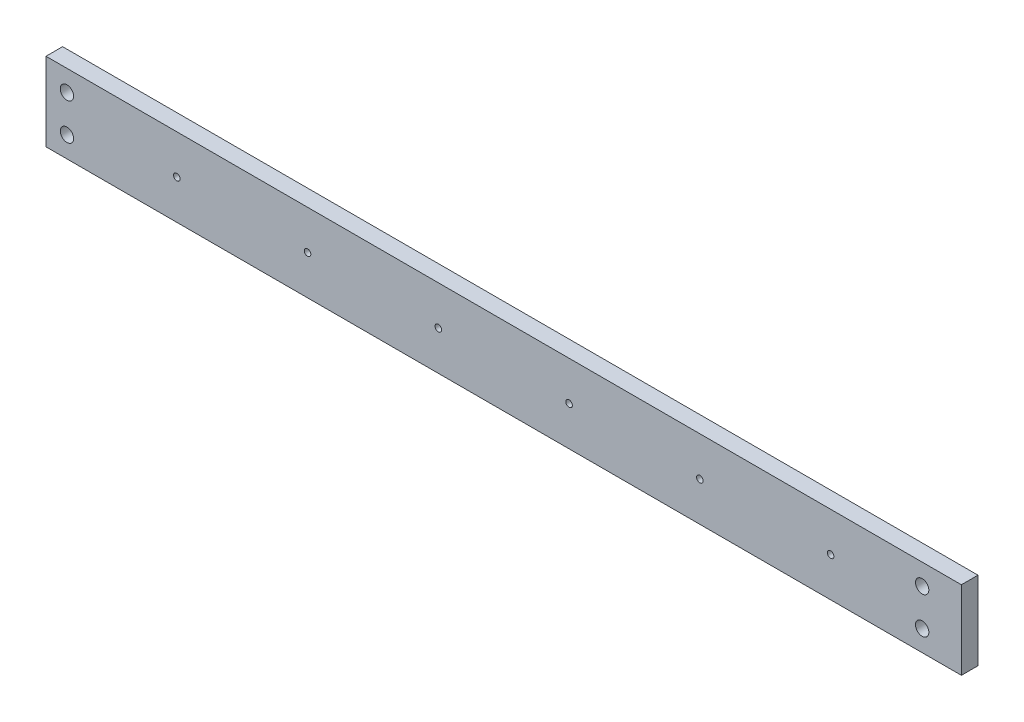
ISO-10303-21;
HEADER;
FILE_DESCRIPTION(('STEP AP214'),'2;1');
FILE_NAME('part.step','',(''),(''),'','','');
FILE_SCHEMA(('AUTOMOTIVE_DESIGN { 1 0 10303 214 1 1 1 1 }'));
ENDSEC;
DATA;
#1=APPLICATION_CONTEXT('core data for automotive mechanical design processes');
#2=APPLICATION_PROTOCOL_DEFINITION('international standard','automotive_design',2000,#1);
#3=PRODUCT_CONTEXT('',#1,'mechanical');
#4=PRODUCT('Part','Part','',(#3));
#5=PRODUCT_RELATED_PRODUCT_CATEGORY('part','',(#4));
#6=PRODUCT_DEFINITION_FORMATION('','',#4);
#7=PRODUCT_DEFINITION_CONTEXT('part definition',#1,'design');
#8=PRODUCT_DEFINITION('design','',#6,#7);
#9=PRODUCT_DEFINITION_SHAPE('','',#8);
#10=(LENGTH_UNIT() NAMED_UNIT(*) SI_UNIT(.MILLI.,.METRE.));
#11=(NAMED_UNIT(*) PLANE_ANGLE_UNIT() SI_UNIT($,.RADIAN.));
#12=(NAMED_UNIT(*) SI_UNIT($,.STERADIAN.) SOLID_ANGLE_UNIT());
#13=UNCERTAINTY_MEASURE_WITH_UNIT(LENGTH_MEASURE(1.E-05),#10,'distance_accuracy_value','');
#14=(GEOMETRIC_REPRESENTATION_CONTEXT(3) GLOBAL_UNCERTAINTY_ASSIGNED_CONTEXT((#13)) GLOBAL_UNIT_ASSIGNED_CONTEXT((#10,
#11,#12)) REPRESENTATION_CONTEXT('',''));
#15=CARTESIAN_POINT('',(0.,0.,0.));
#16=DIRECTION('',(0.,0.,1.));
#17=DIRECTION('',(1.,0.,0.));
#18=AXIS2_PLACEMENT_3D('',#15,#16,#17);
#19=CARTESIAN_POINT('',(300.,15.,6.35));
#20=DIRECTION('',(0.,0.,1.));
#21=DIRECTION('',(1.,0.,0.));
#22=AXIS2_PLACEMENT_3D('',#19,#20,#21);
#23=CYLINDRICAL_SURFACE('',#22,1.25);
#24=CARTESIAN_POINT('',(300.,15.,0.));
#25=DIRECTION('',(0.,0.,1.));
#26=DIRECTION('',(1.,0.,0.));
#27=AXIS2_PLACEMENT_3D('',#24,#25,#26);
#28=CIRCLE('',#27,1.25);
#29=CARTESIAN_POINT('',(301.25,15.,0.));
#30=VERTEX_POINT('',#29);
#31=EDGE_CURVE('E49',#30,#30,#28,.T.);
#32=ORIENTED_EDGE('',*,*,#31,.F.);
#33=EDGE_LOOP('',(#32));
#34=FACE_BOUND('',#33,.T.);
#35=CARTESIAN_POINT('',(300.,15.,6.35));
#36=DIRECTION('',(0.,0.,1.));
#37=DIRECTION('',(1.,0.,0.));
#38=AXIS2_PLACEMENT_3D('',#35,#36,#37);
#39=CIRCLE('',#38,1.25);
#40=CARTESIAN_POINT('',(301.25,15.,6.35));
#41=VERTEX_POINT('',#40);
#42=EDGE_CURVE('E11',#41,#41,#39,.T.);
#43=ORIENTED_EDGE('',*,*,#42,.T.);
#44=EDGE_LOOP('',(#43));
#45=FACE_BOUND('',#44,.T.);
#46=ADVANCED_FACE('F41',(#34,#45),#23,.F.);
#47=CARTESIAN_POINT('',(250.,15.,6.35));
#48=DIRECTION('',(0.,0.,1.));
#49=DIRECTION('',(1.,0.,0.));
#50=AXIS2_PLACEMENT_3D('',#47,#48,#49);
#51=CYLINDRICAL_SURFACE('',#50,1.25);
#52=CARTESIAN_POINT('',(250.,15.,0.));
#53=DIRECTION('',(0.,0.,1.));
#54=DIRECTION('',(1.,0.,0.));
#55=AXIS2_PLACEMENT_3D('',#52,#53,#54);
#56=CIRCLE('',#55,1.25);
#57=CARTESIAN_POINT('',(251.25,15.,0.));
#58=VERTEX_POINT('',#57);
#59=EDGE_CURVE('E131',#58,#58,#56,.T.);
#60=ORIENTED_EDGE('',*,*,#59,.F.);
#61=EDGE_LOOP('',(#60));
#62=FACE_BOUND('',#61,.T.);
#63=CARTESIAN_POINT('',(250.,15.,6.35));
#64=DIRECTION('',(0.,0.,1.));
#65=DIRECTION('',(1.,0.,0.));
#66=AXIS2_PLACEMENT_3D('',#63,#64,#65);
#67=CIRCLE('',#66,1.25);
#68=CARTESIAN_POINT('',(251.25,15.,6.35));
#69=VERTEX_POINT('',#68);
#70=EDGE_CURVE('E134',#69,#69,#67,.T.);
#71=ORIENTED_EDGE('',*,*,#70,.T.);
#72=EDGE_LOOP('',(#71));
#73=FACE_BOUND('',#72,.T.);
#74=ADVANCED_FACE('F143',(#62,#73),#51,.F.);
#75=CARTESIAN_POINT('',(200.,15.,6.35));
#76=DIRECTION('',(0.,0.,1.));
#77=DIRECTION('',(1.,0.,0.));
#78=AXIS2_PLACEMENT_3D('',#75,#76,#77);
#79=CYLINDRICAL_SURFACE('',#78,1.25);
#80=CARTESIAN_POINT('',(200.,15.,0.));
#81=DIRECTION('',(0.,0.,1.));
#82=DIRECTION('',(1.,0.,0.));
#83=AXIS2_PLACEMENT_3D('',#80,#81,#82);
#84=CIRCLE('',#83,1.25);
#85=CARTESIAN_POINT('',(201.25,15.,0.));
#86=VERTEX_POINT('',#85);
#87=EDGE_CURVE('E125',#86,#86,#84,.T.);
#88=ORIENTED_EDGE('',*,*,#87,.F.);
#89=EDGE_LOOP('',(#88));
#90=FACE_BOUND('',#89,.T.);
#91=CARTESIAN_POINT('',(200.,15.,6.35));
#92=DIRECTION('',(0.,0.,1.));
#93=DIRECTION('',(1.,0.,0.));
#94=AXIS2_PLACEMENT_3D('',#91,#92,#93);
#95=CIRCLE('',#94,1.25);
#96=CARTESIAN_POINT('',(201.25,15.,6.35));
#97=VERTEX_POINT('',#96);
#98=EDGE_CURVE('E128',#97,#97,#95,.T.);
#99=ORIENTED_EDGE('',*,*,#98,.T.);
#100=EDGE_LOOP('',(#99));
#101=FACE_BOUND('',#100,.T.);
#102=ADVANCED_FACE('F175',(#90,#101),#79,.F.);
#103=CARTESIAN_POINT('',(150.,15.,6.35));
#104=DIRECTION('',(0.,0.,1.));
#105=DIRECTION('',(1.,0.,0.));
#106=AXIS2_PLACEMENT_3D('',#103,#104,#105);
#107=CYLINDRICAL_SURFACE('',#106,1.25);
#108=CARTESIAN_POINT('',(150.,15.,0.));
#109=DIRECTION('',(0.,0.,1.));
#110=DIRECTION('',(1.,0.,0.));
#111=AXIS2_PLACEMENT_3D('',#108,#109,#110);
#112=CIRCLE('',#111,1.25);
#113=CARTESIAN_POINT('',(151.25,15.,0.));
#114=VERTEX_POINT('',#113);
#115=EDGE_CURVE('E119',#114,#114,#112,.T.);
#116=ORIENTED_EDGE('',*,*,#115,.F.);
#117=EDGE_LOOP('',(#116));
#118=FACE_BOUND('',#117,.T.);
#119=CARTESIAN_POINT('',(150.,15.,6.35));
#120=DIRECTION('',(0.,0.,1.));
#121=DIRECTION('',(1.,0.,0.));
#122=AXIS2_PLACEMENT_3D('',#119,#120,#121);
#123=CIRCLE('',#122,1.25);
#124=CARTESIAN_POINT('',(151.25,15.,6.35));
#125=VERTEX_POINT('',#124);
#126=EDGE_CURVE('E122',#125,#125,#123,.T.);
#127=ORIENTED_EDGE('',*,*,#126,.T.);
#128=EDGE_LOOP('',(#127));
#129=FACE_BOUND('',#128,.T.);
#130=ADVANCED_FACE('F171',(#118,#129),#107,.F.);
#131=CARTESIAN_POINT('',(0.,0.,6.35));
#132=DIRECTION('',(1.,0.,0.));
#133=DIRECTION('',(0.,0.,-1.));
#134=AXIS2_PLACEMENT_3D('',#131,#132,#133);
#135=PLANE('',#134);
#136=DIRECTION('',(0.,-1.,0.));
#137=VECTOR('',#136,1.);
#138=CARTESIAN_POINT('',(0.,0.,0.));
#139=LINE('',#138,#137);
#140=CARTESIAN_POINT('',(0.,30.,0.));
#141=VERTEX_POINT('',#140);
#142=CARTESIAN_POINT('',(0.,0.,0.));
#143=VERTEX_POINT('',#142);
#144=EDGE_CURVE('E109',#141,#143,#139,.T.);
#145=ORIENTED_EDGE('',*,*,#144,.T.);
#146=DIRECTION('',(0.,0.,-1.));
#147=VECTOR('',#146,1.);
#148=CARTESIAN_POINT('',(0.,0.,6.35));
#149=LINE('',#148,#147);
#150=CARTESIAN_POINT('',(0.,0.,6.35));
#151=VERTEX_POINT('',#150);
#152=EDGE_CURVE('E100',#151,#143,#149,.T.);
#153=ORIENTED_EDGE('',*,*,#152,.F.);
#154=DIRECTION('',(0.,-1.,0.));
#155=VECTOR('',#154,1.);
#156=CARTESIAN_POINT('',(0.,0.,6.35));
#157=LINE('',#156,#155);
#158=CARTESIAN_POINT('',(0.,30.,6.35));
#159=VERTEX_POINT('',#158);
#160=EDGE_CURVE('E94',#159,#151,#157,.T.);
#161=ORIENTED_EDGE('',*,*,#160,.F.);
#162=DIRECTION('',(0.,0.,-1.));
#163=VECTOR('',#162,1.);
#164=CARTESIAN_POINT('',(0.,30.,6.35));
#165=LINE('',#164,#163);
#166=EDGE_CURVE('E105',#159,#141,#165,.T.);
#167=ORIENTED_EDGE('',*,*,#166,.T.);
#168=EDGE_LOOP('',(#145,#153,#161,#167));
#169=FACE_BOUND('',#168,.T.);
#170=ADVANCED_FACE('F168',(#169),#135,.F.);
#171=CARTESIAN_POINT('',(0.,0.,6.35));
#172=DIRECTION('',(0.,1.,0.));
#173=DIRECTION('',(0.,0.,1.));
#174=AXIS2_PLACEMENT_3D('',#171,#172,#173);
#175=PLANE('',#174);
#176=DIRECTION('',(1.,0.,0.));
#177=VECTOR('',#176,1.);
#178=CARTESIAN_POINT('',(0.,0.,0.));
#179=LINE('',#178,#177);
#180=CARTESIAN_POINT('',(350.,0.,0.));
#181=VERTEX_POINT('',#180);
#182=EDGE_CURVE('E99',#143,#181,#179,.T.);
#183=ORIENTED_EDGE('',*,*,#182,.T.);
#184=DIRECTION('',(0.,0.,-1.));
#185=VECTOR('',#184,1.);
#186=CARTESIAN_POINT('',(350.,0.,6.35));
#187=LINE('',#186,#185);
#188=CARTESIAN_POINT('',(350.,0.,6.35));
#189=VERTEX_POINT('',#188);
#190=EDGE_CURVE('E97',#189,#181,#187,.T.);
#191=ORIENTED_EDGE('',*,*,#190,.F.);
#192=DIRECTION('',(1.,0.,0.));
#193=VECTOR('',#192,1.);
#194=CARTESIAN_POINT('',(0.,0.,6.35));
#195=LINE('',#194,#193);
#196=EDGE_CURVE('E88',#151,#189,#195,.T.);
#197=ORIENTED_EDGE('',*,*,#196,.F.);
#198=ORIENTED_EDGE('',*,*,#152,.T.);
#199=EDGE_LOOP('',(#183,#191,#197,#198));
#200=FACE_BOUND('',#199,.T.);
#201=ADVANCED_FACE('F98',(#200),#175,.F.);
#202=CARTESIAN_POINT('',(350.,0.,6.35));
#203=DIRECTION('',(-1.,0.,0.));
#204=DIRECTION('',(0.,0.,1.));
#205=AXIS2_PLACEMENT_3D('',#202,#203,#204);
#206=PLANE('',#205);
#207=DIRECTION('',(0.,1.,0.));
#208=VECTOR('',#207,1.);
#209=CARTESIAN_POINT('',(350.,0.,0.));
#210=LINE('',#209,#208);
#211=CARTESIAN_POINT('',(350.,30.,0.));
#212=VERTEX_POINT('',#211);
#213=EDGE_CURVE('E74',#181,#212,#210,.T.);
#214=ORIENTED_EDGE('',*,*,#213,.T.);
#215=DIRECTION('',(0.,0.,-1.));
#216=VECTOR('',#215,1.);
#217=CARTESIAN_POINT('',(350.,30.,6.35));
#218=LINE('',#217,#216);
#219=CARTESIAN_POINT('',(350.,30.,6.35));
#220=VERTEX_POINT('',#219);
#221=EDGE_CURVE('E101',#220,#212,#218,.T.);
#222=ORIENTED_EDGE('',*,*,#221,.F.);
#223=DIRECTION('',(0.,1.,0.));
#224=VECTOR('',#223,1.);
#225=CARTESIAN_POINT('',(350.,0.,6.35));
#226=LINE('',#225,#224);
#227=EDGE_CURVE('E92',#189,#220,#226,.T.);
#228=ORIENTED_EDGE('',*,*,#227,.F.);
#229=ORIENTED_EDGE('',*,*,#190,.T.);
#230=EDGE_LOOP('',(#214,#222,#228,#229));
#231=FACE_BOUND('',#230,.T.);
#232=ADVANCED_FACE('F103',(#231),#206,.F.);
#233=CARTESIAN_POINT('',(0.,30.,6.35));
#234=DIRECTION('',(0.,-1.,0.));
#235=DIRECTION('',(0.,0.,-1.));
#236=AXIS2_PLACEMENT_3D('',#233,#234,#235);
#237=PLANE('',#236);
#238=DIRECTION('',(-1.,0.,0.));
#239=VECTOR('',#238,1.);
#240=CARTESIAN_POINT('',(0.,30.,0.));
#241=LINE('',#240,#239);
#242=EDGE_CURVE('E80',#212,#141,#241,.T.);
#243=ORIENTED_EDGE('',*,*,#242,.T.);
#244=ORIENTED_EDGE('',*,*,#166,.F.);
#245=DIRECTION('',(-1.,0.,0.));
#246=VECTOR('',#245,1.);
#247=CARTESIAN_POINT('',(0.,30.,6.35));
#248=LINE('',#247,#246);
#249=EDGE_CURVE('E57',#220,#159,#248,.T.);
#250=ORIENTED_EDGE('',*,*,#249,.F.);
#251=ORIENTED_EDGE('',*,*,#221,.T.);
#252=EDGE_LOOP('',(#243,#244,#250,#251));
#253=FACE_BOUND('',#252,.T.);
#254=ADVANCED_FACE('F147',(#253),#237,.F.);
#255=CARTESIAN_POINT('',(0.,0.,6.35));
#256=DIRECTION('',(0.,0.,-1.));
#257=DIRECTION('',(-1.,0.,0.));
#258=AXIS2_PLACEMENT_3D('',#255,#256,#257);
#259=PLANE('',#258);
#260=CARTESIAN_POINT('',(335.,22.,6.35));
#261=DIRECTION('',(0.,0.,-1.));
#262=DIRECTION('',(-1.,0.,0.));
#263=AXIS2_PLACEMENT_3D('',#260,#261,#262);
#264=CIRCLE('',#263,2.55270000000002);
#265=CARTESIAN_POINT('',(332.4473,22.,6.35));
#266=VERTEX_POINT('',#265);
#267=EDGE_CURVE('E297',#266,#266,#264,.T.);
#268=ORIENTED_EDGE('',*,*,#267,.T.);
#269=EDGE_LOOP('',(#268));
#270=FACE_BOUND('',#269,.T.);
#271=CARTESIAN_POINT('',(335.,8.,6.35));
#272=DIRECTION('',(0.,0.,-1.));
#273=DIRECTION('',(-1.,0.,0.));
#274=AXIS2_PLACEMENT_3D('',#271,#272,#273);
#275=CIRCLE('',#274,2.55270000000002);
#276=CARTESIAN_POINT('',(332.4473,8.,6.35));
#277=VERTEX_POINT('',#276);
#278=EDGE_CURVE('E291',#277,#277,#275,.T.);
#279=ORIENTED_EDGE('',*,*,#278,.T.);
#280=EDGE_LOOP('',(#279));
#281=FACE_BOUND('',#280,.T.);
#282=CARTESIAN_POINT('',(100.,15.,6.35));
#283=DIRECTION('',(0.,0.,1.));
#284=DIRECTION('',(1.,0.,0.));
#285=AXIS2_PLACEMENT_3D('',#282,#283,#284);
#286=CIRCLE('',#285,1.25);
#287=CARTESIAN_POINT('',(101.25,15.,6.35));
#288=VERTEX_POINT('',#287);
#289=EDGE_CURVE('E285',#288,#288,#286,.T.);
#290=ORIENTED_EDGE('',*,*,#289,.F.);
#291=EDGE_LOOP('',(#290));
#292=FACE_BOUND('',#291,.T.);
#293=CARTESIAN_POINT('',(50.,15.,6.35));
#294=DIRECTION('',(0.,0.,1.));
#295=DIRECTION('',(1.,0.,0.));
#296=AXIS2_PLACEMENT_3D('',#293,#294,#295);
#297=CIRCLE('',#296,1.25);
#298=CARTESIAN_POINT('',(51.25,15.,6.35));
#299=VERTEX_POINT('',#298);
#300=EDGE_CURVE('E260',#299,#299,#297,.T.);
#301=ORIENTED_EDGE('',*,*,#300,.F.);
#302=EDGE_LOOP('',(#301));
#303=FACE_BOUND('',#302,.T.);
#304=CARTESIAN_POINT('',(8.00000000000001,22.,6.35));
#305=DIRECTION('',(0.,0.,1.));
#306=DIRECTION('',(1.,0.,0.));
#307=AXIS2_PLACEMENT_3D('',#304,#305,#306);
#308=CIRCLE('',#307,2.5527);
#309=CARTESIAN_POINT('',(10.5527,22.,6.35));
#310=VERTEX_POINT('',#309);
#311=EDGE_CURVE('E253',#310,#310,#308,.T.);
#312=ORIENTED_EDGE('',*,*,#311,.F.);
#313=EDGE_LOOP('',(#312));
#314=FACE_BOUND('',#313,.T.);
#315=CARTESIAN_POINT('',(8.,8.,6.35));
#316=DIRECTION('',(0.,0.,1.));
#317=DIRECTION('',(1.,0.,0.));
#318=AXIS2_PLACEMENT_3D('',#315,#316,#317);
#319=CIRCLE('',#318,2.5527);
#320=CARTESIAN_POINT('',(10.5527,8.,6.35));
#321=VERTEX_POINT('',#320);
#322=EDGE_CURVE('E257',#321,#321,#319,.T.);
#323=ORIENTED_EDGE('',*,*,#322,.F.);
#324=EDGE_LOOP('',(#323));
#325=FACE_BOUND('',#324,.T.);
#326=ORIENTED_EDGE('',*,*,#160,.T.);
#327=ORIENTED_EDGE('',*,*,#196,.T.);
#328=ORIENTED_EDGE('',*,*,#227,.T.);
#329=ORIENTED_EDGE('',*,*,#249,.T.);
#330=EDGE_LOOP('',(#326,#327,#328,#329));
#331=FACE_BOUND('',#330,.T.);
#332=ORIENTED_EDGE('',*,*,#126,.F.);
#333=EDGE_LOOP('',(#332));
#334=FACE_BOUND('',#333,.T.);
#335=ORIENTED_EDGE('',*,*,#98,.F.);
#336=EDGE_LOOP('',(#335));
#337=FACE_BOUND('',#336,.T.);
#338=ORIENTED_EDGE('',*,*,#70,.F.);
#339=EDGE_LOOP('',(#338));
#340=FACE_BOUND('',#339,.T.);
#341=ORIENTED_EDGE('',*,*,#42,.F.);
#342=EDGE_LOOP('',(#341));
#343=FACE_BOUND('',#342,.T.);
#344=ADVANCED_FACE('F89',(#270,#281,#292,#303,#314,#325,#331,#334,#337,#340,#343),#259,.F.);
#345=CARTESIAN_POINT('',(0.,0.,0.));
#346=DIRECTION('',(0.,0.,-1.));
#347=DIRECTION('',(-1.,0.,0.));
#348=AXIS2_PLACEMENT_3D('',#345,#346,#347);
#349=PLANE('',#348);
#350=CARTESIAN_POINT('',(335.,22.,0.));
#351=DIRECTION('',(0.,0.,-1.));
#352=DIRECTION('',(-1.,0.,0.));
#353=AXIS2_PLACEMENT_3D('',#350,#351,#352);
#354=CIRCLE('',#353,2.55269999999996);
#355=CARTESIAN_POINT('',(332.4473,22.,0.));
#356=VERTEX_POINT('',#355);
#357=EDGE_CURVE('E299',#356,#356,#354,.T.);
#358=ORIENTED_EDGE('',*,*,#357,.F.);
#359=EDGE_LOOP('',(#358));
#360=FACE_BOUND('',#359,.T.);
#361=CARTESIAN_POINT('',(335.,8.,0.));
#362=DIRECTION('',(0.,0.,-1.));
#363=DIRECTION('',(-1.,0.,0.));
#364=AXIS2_PLACEMENT_3D('',#361,#362,#363);
#365=CIRCLE('',#364,2.55269999999996);
#366=CARTESIAN_POINT('',(332.4473,8.,0.));
#367=VERTEX_POINT('',#366);
#368=EDGE_CURVE('E294',#367,#367,#365,.T.);
#369=ORIENTED_EDGE('',*,*,#368,.F.);
#370=EDGE_LOOP('',(#369));
#371=FACE_BOUND('',#370,.T.);
#372=CARTESIAN_POINT('',(100.,15.,0.));
#373=DIRECTION('',(0.,0.,1.));
#374=DIRECTION('',(1.,0.,0.));
#375=AXIS2_PLACEMENT_3D('',#372,#373,#374);
#376=CIRCLE('',#375,1.25);
#377=CARTESIAN_POINT('',(101.25,15.,0.));
#378=VERTEX_POINT('',#377);
#379=EDGE_CURVE('E288',#378,#378,#376,.T.);
#380=ORIENTED_EDGE('',*,*,#379,.T.);
#381=EDGE_LOOP('',(#380));
#382=FACE_BOUND('',#381,.T.);
#383=CARTESIAN_POINT('',(50.,15.,0.));
#384=DIRECTION('',(0.,0.,1.));
#385=DIRECTION('',(1.,0.,0.));
#386=AXIS2_PLACEMENT_3D('',#383,#384,#385);
#387=CIRCLE('',#386,1.25);
#388=CARTESIAN_POINT('',(51.25,15.,0.));
#389=VERTEX_POINT('',#388);
#390=EDGE_CURVE('E255',#389,#389,#387,.T.);
#391=ORIENTED_EDGE('',*,*,#390,.T.);
#392=EDGE_LOOP('',(#391));
#393=FACE_BOUND('',#392,.T.);
#394=CARTESIAN_POINT('',(8.00000000000001,22.,0.));
#395=DIRECTION('',(0.,0.,1.));
#396=DIRECTION('',(1.,0.,0.));
#397=AXIS2_PLACEMENT_3D('',#394,#395,#396);
#398=CIRCLE('',#397,2.5527);
#399=CARTESIAN_POINT('',(10.5527,22.,0.));
#400=VERTEX_POINT('',#399);
#401=EDGE_CURVE('E250',#400,#400,#398,.T.);
#402=ORIENTED_EDGE('',*,*,#401,.T.);
#403=EDGE_LOOP('',(#402));
#404=FACE_BOUND('',#403,.T.);
#405=CARTESIAN_POINT('',(8.,8.,0.));
#406=DIRECTION('',(0.,0.,1.));
#407=DIRECTION('',(1.,0.,0.));
#408=AXIS2_PLACEMENT_3D('',#405,#406,#407);
#409=CIRCLE('',#408,2.5527);
#410=CARTESIAN_POINT('',(10.5527,8.,0.));
#411=VERTEX_POINT('',#410);
#412=EDGE_CURVE('E112',#411,#411,#409,.T.);
#413=ORIENTED_EDGE('',*,*,#412,.T.);
#414=EDGE_LOOP('',(#413));
#415=FACE_BOUND('',#414,.T.);
#416=ORIENTED_EDGE('',*,*,#144,.F.);
#417=ORIENTED_EDGE('',*,*,#242,.F.);
#418=ORIENTED_EDGE('',*,*,#213,.F.);
#419=ORIENTED_EDGE('',*,*,#182,.F.);
#420=EDGE_LOOP('',(#416,#417,#418,#419));
#421=FACE_BOUND('',#420,.T.);
#422=ORIENTED_EDGE('',*,*,#115,.T.);
#423=EDGE_LOOP('',(#422));
#424=FACE_BOUND('',#423,.T.);
#425=ORIENTED_EDGE('',*,*,#87,.T.);
#426=EDGE_LOOP('',(#425));
#427=FACE_BOUND('',#426,.T.);
#428=ORIENTED_EDGE('',*,*,#59,.T.);
#429=EDGE_LOOP('',(#428));
#430=FACE_BOUND('',#429,.T.);
#431=ORIENTED_EDGE('',*,*,#31,.T.);
#432=EDGE_LOOP('',(#431));
#433=FACE_BOUND('',#432,.T.);
#434=ADVANCED_FACE('F139',(#360,#371,#382,#393,#404,#415,#421,#424,#427,#430,#433),#349,.T.);
#435=CARTESIAN_POINT('',(8.,8.,6.35));
#436=DIRECTION('',(0.,0.,1.));
#437=DIRECTION('',(1.,0.,0.));
#438=AXIS2_PLACEMENT_3D('',#435,#436,#437);
#439=CYLINDRICAL_SURFACE('',#438,2.5527);
#440=ORIENTED_EDGE('',*,*,#412,.F.);
#441=EDGE_LOOP('',(#440));
#442=FACE_BOUND('',#441,.T.);
#443=ORIENTED_EDGE('',*,*,#322,.T.);
#444=EDGE_LOOP('',(#443));
#445=FACE_BOUND('',#444,.T.);
#446=ADVANCED_FACE('F154',(#442,#445),#439,.F.);
#447=CARTESIAN_POINT('',(8.00000000000001,22.,6.35));
#448=DIRECTION('',(0.,0.,1.));
#449=DIRECTION('',(1.,0.,0.));
#450=AXIS2_PLACEMENT_3D('',#447,#448,#449);
#451=CYLINDRICAL_SURFACE('',#450,2.5527);
#452=ORIENTED_EDGE('',*,*,#401,.F.);
#453=EDGE_LOOP('',(#452));
#454=FACE_BOUND('',#453,.T.);
#455=ORIENTED_EDGE('',*,*,#311,.T.);
#456=EDGE_LOOP('',(#455));
#457=FACE_BOUND('',#456,.T.);
#458=ADVANCED_FACE('F239',(#454,#457),#451,.F.);
#459=CARTESIAN_POINT('',(50.,15.,6.35));
#460=DIRECTION('',(0.,0.,1.));
#461=DIRECTION('',(1.,0.,0.));
#462=AXIS2_PLACEMENT_3D('',#459,#460,#461);
#463=CYLINDRICAL_SURFACE('',#462,1.25);
#464=ORIENTED_EDGE('',*,*,#390,.F.);
#465=EDGE_LOOP('',(#464));
#466=FACE_BOUND('',#465,.T.);
#467=ORIENTED_EDGE('',*,*,#300,.T.);
#468=EDGE_LOOP('',(#467));
#469=FACE_BOUND('',#468,.T.);
#470=ADVANCED_FACE('F208',(#466,#469),#463,.F.);
#471=CARTESIAN_POINT('',(100.,15.,6.35));
#472=DIRECTION('',(0.,0.,1.));
#473=DIRECTION('',(1.,0.,0.));
#474=AXIS2_PLACEMENT_3D('',#471,#472,#473);
#475=CYLINDRICAL_SURFACE('',#474,1.25);
#476=ORIENTED_EDGE('',*,*,#379,.F.);
#477=EDGE_LOOP('',(#476));
#478=FACE_BOUND('',#477,.T.);
#479=ORIENTED_EDGE('',*,*,#289,.T.);
#480=EDGE_LOOP('',(#479));
#481=FACE_BOUND('',#480,.T.);
#482=ADVANCED_FACE('F205',(#478,#481),#475,.F.);
#483=CARTESIAN_POINT('',(335.,8.,0.));
#484=DIRECTION('',(0.,0.,-1.));
#485=DIRECTION('',(-1.,0.,0.));
#486=AXIS2_PLACEMENT_3D('',#483,#484,#485);
#487=CYLINDRICAL_SURFACE('',#486,2.55269999999999);
#488=ORIENTED_EDGE('',*,*,#278,.F.);
#489=EDGE_LOOP('',(#488));
#490=FACE_BOUND('',#489,.T.);
#491=ORIENTED_EDGE('',*,*,#368,.T.);
#492=EDGE_LOOP('',(#491));
#493=FACE_BOUND('',#492,.T.);
#494=ADVANCED_FACE('F207',(#490,#493),#487,.F.);
#495=CARTESIAN_POINT('',(335.,22.,0.));
#496=DIRECTION('',(0.,0.,-1.));
#497=DIRECTION('',(-1.,0.,0.));
#498=AXIS2_PLACEMENT_3D('',#495,#496,#497);
#499=CYLINDRICAL_SURFACE('',#498,2.55269999999999);
#500=ORIENTED_EDGE('',*,*,#267,.F.);
#501=EDGE_LOOP('',(#500));
#502=FACE_BOUND('',#501,.T.);
#503=ORIENTED_EDGE('',*,*,#357,.T.);
#504=EDGE_LOOP('',(#503));
#505=FACE_BOUND('',#504,.T.);
#506=ADVANCED_FACE('F222',(#502,#505),#499,.F.);
#507=CLOSED_SHELL('',(#46,#74,#102,#130,#170,#201,#232,#254,#344,#434,#446,#458,#470,#482,#494,#506));
#508=MANIFOLD_SOLID_BREP('B2',#507);
#509=ADVANCED_BREP_SHAPE_REPRESENTATION('',(#18,#508),#14);
#510=SHAPE_DEFINITION_REPRESENTATION(#9,#509);
ENDSEC;
END-ISO-10303-21;
